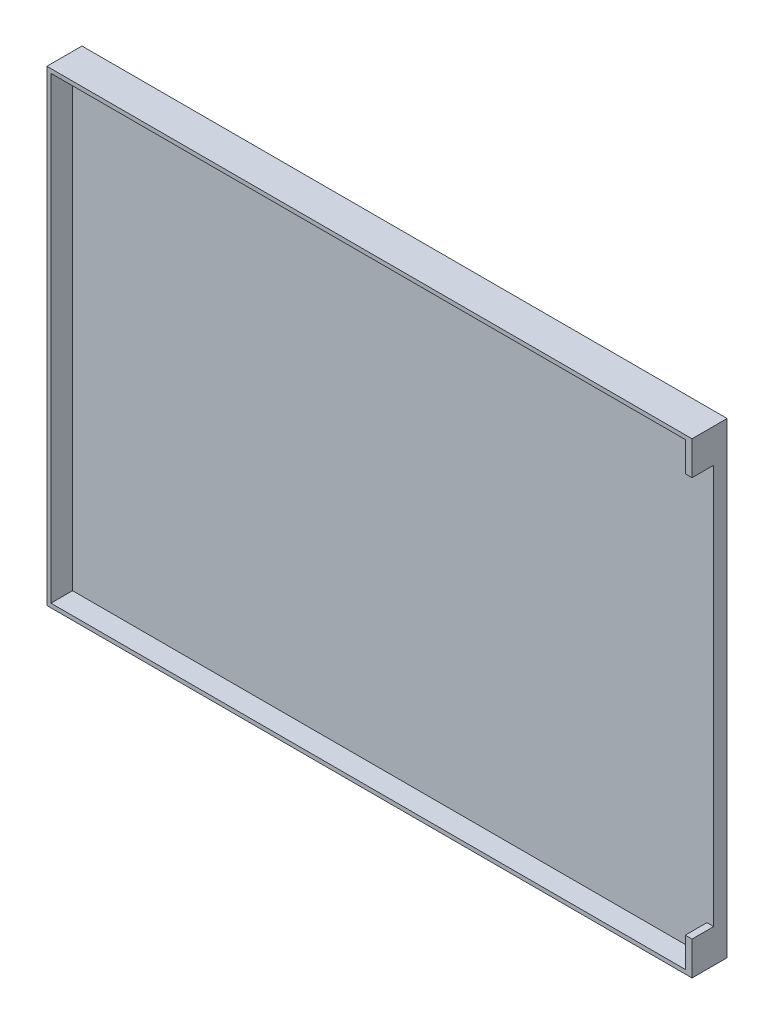
ISO-10303-21;
HEADER;
FILE_DESCRIPTION(('STEP AP214'),'2;1');
FILE_NAME('part.step','',(''),(''),'','','');
FILE_SCHEMA(('AUTOMOTIVE_DESIGN { 1 0 10303 214 1 1 1 1 }'));
ENDSEC;
DATA;
#1=APPLICATION_CONTEXT('core data for automotive mechanical design processes');
#2=APPLICATION_PROTOCOL_DEFINITION('international standard','automotive_design',2000,#1);
#3=PRODUCT_CONTEXT('',#1,'mechanical');
#4=PRODUCT('Part','Part','',(#3));
#5=PRODUCT_RELATED_PRODUCT_CATEGORY('part','',(#4));
#6=PRODUCT_DEFINITION_FORMATION('','',#4);
#7=PRODUCT_DEFINITION_CONTEXT('part definition',#1,'design');
#8=PRODUCT_DEFINITION('design','',#6,#7);
#9=PRODUCT_DEFINITION_SHAPE('','',#8);
#10=(LENGTH_UNIT() NAMED_UNIT(*) SI_UNIT(.MILLI.,.METRE.));
#11=(NAMED_UNIT(*) PLANE_ANGLE_UNIT() SI_UNIT($,.RADIAN.));
#12=(NAMED_UNIT(*) SI_UNIT($,.STERADIAN.) SOLID_ANGLE_UNIT());
#13=UNCERTAINTY_MEASURE_WITH_UNIT(LENGTH_MEASURE(1.E-05),#10,'distance_accuracy_value','');
#14=(GEOMETRIC_REPRESENTATION_CONTEXT(3) GLOBAL_UNCERTAINTY_ASSIGNED_CONTEXT((#13)) GLOBAL_UNIT_ASSIGNED_CONTEXT((#10,
#11,#12)) REPRESENTATION_CONTEXT('',''));
#15=CARTESIAN_POINT('',(0.,0.,0.));
#16=DIRECTION('',(0.,0.,1.));
#17=DIRECTION('',(1.,0.,0.));
#18=AXIS2_PLACEMENT_3D('',#15,#16,#17);
#19=CARTESIAN_POINT('',(0.,0.,1.));
#20=DIRECTION('',(0.,0.,-1.));
#21=DIRECTION('',(-1.,0.,0.));
#22=AXIS2_PLACEMENT_3D('',#19,#20,#21);
#23=PLANE('',#22);
#24=DIRECTION('',(1.,0.,0.));
#25=VECTOR('',#24,1.);
#26=CARTESIAN_POINT('',(23.4,14.8,1.));
#27=LINE('',#26,#25);
#28=CARTESIAN_POINT('',(23.4,14.8,1.));
#29=VERTEX_POINT('',#28);
#30=CARTESIAN_POINT('',(23.9,14.8,1.));
#31=VERTEX_POINT('',#30);
#32=EDGE_CURVE('E48',#29,#31,#27,.T.);
#33=ORIENTED_EDGE('',*,*,#32,.F.);
#34=DIRECTION('',(0.,-1.,0.));
#35=VECTOR('',#34,1.);
#36=CARTESIAN_POINT('',(23.4,17.,1.));
#37=LINE('',#36,#35);
#38=CARTESIAN_POINT('',(23.4,17.,1.));
#39=VERTEX_POINT('',#38);
#40=EDGE_CURVE('E52',#39,#29,#37,.T.);
#41=ORIENTED_EDGE('',*,*,#40,.F.);
#42=DIRECTION('',(1.,0.,0.));
#43=VECTOR('',#42,1.);
#44=CARTESIAN_POINT('',(23.4,17.,1.));
#45=LINE('',#44,#43);
#46=CARTESIAN_POINT('',(-23.6,17.,1.));
#47=VERTEX_POINT('',#46);
#48=EDGE_CURVE('E205',#47,#39,#45,.T.);
#49=ORIENTED_EDGE('',*,*,#48,.F.);
#50=DIRECTION('',(0.,1.,0.));
#51=VECTOR('',#50,1.);
#52=CARTESIAN_POINT('',(-23.6,17.,1.));
#53=LINE('',#52,#51);
#54=CARTESIAN_POINT('',(-23.6,-17.,1.));
#55=VERTEX_POINT('',#54);
#56=EDGE_CURVE('E202',#55,#47,#53,.T.);
#57=ORIENTED_EDGE('',*,*,#56,.F.);
#58=DIRECTION('',(-1.,0.,0.));
#59=VECTOR('',#58,1.);
#60=CARTESIAN_POINT('',(-23.6,-17.,1.));
#61=LINE('',#60,#59);
#62=CARTESIAN_POINT('',(23.4,-17.,1.));
#63=VERTEX_POINT('',#62);
#64=EDGE_CURVE('E199',#63,#55,#61,.T.);
#65=ORIENTED_EDGE('',*,*,#64,.F.);
#66=DIRECTION('',(0.,-1.,0.));
#67=VECTOR('',#66,1.);
#68=CARTESIAN_POINT('',(23.4,-17.,1.));
#69=LINE('',#68,#67);
#70=CARTESIAN_POINT('',(23.4,-14.8,1.));
#71=VERTEX_POINT('',#70);
#72=EDGE_CURVE('E196',#71,#63,#69,.T.);
#73=ORIENTED_EDGE('',*,*,#72,.F.);
#74=DIRECTION('',(-1.,0.,0.));
#75=VECTOR('',#74,1.);
#76=CARTESIAN_POINT('',(23.4,-14.8,1.));
#77=LINE('',#76,#75);
#78=CARTESIAN_POINT('',(23.9,-14.8,1.));
#79=VERTEX_POINT('',#78);
#80=EDGE_CURVE('E194',#79,#71,#77,.T.);
#81=ORIENTED_EDGE('',*,*,#80,.F.);
#82=DIRECTION('',(0.,1.,0.));
#83=VECTOR('',#82,1.);
#84=CARTESIAN_POINT('',(23.9,-17.3,1.));
#85=LINE('',#84,#83);
#86=EDGE_CURVE('E145',#79,#31,#85,.T.);
#87=ORIENTED_EDGE('',*,*,#86,.T.);
#88=EDGE_LOOP('',(#33,#41,#49,#57,#65,#73,#81,#87));
#89=FACE_BOUND('',#88,.T.);
#90=ADVANCED_FACE('F33',(#89),#23,.F.);
#91=CARTESIAN_POINT('',(23.9,-17.3,1.));
#92=DIRECTION('',(-1.,0.,0.));
#93=DIRECTION('',(0.,0.,1.));
#94=AXIS2_PLACEMENT_3D('',#91,#92,#93);
#95=PLANE('',#94);
#96=DIRECTION('',(0.,1.,0.));
#97=VECTOR('',#96,1.);
#98=CARTESIAN_POINT('',(23.9,-17.3,0.));
#99=LINE('',#98,#97);
#100=CARTESIAN_POINT('',(23.9,-17.3,0.));
#101=VERTEX_POINT('',#100);
#102=CARTESIAN_POINT('',(23.9,17.3,0.));
#103=VERTEX_POINT('',#102);
#104=EDGE_CURVE('E146',#101,#103,#99,.T.);
#105=ORIENTED_EDGE('',*,*,#104,.T.);
#106=DIRECTION('',(0.,0.,-1.));
#107=VECTOR('',#106,1.);
#108=CARTESIAN_POINT('',(23.9,17.3,1.));
#109=LINE('',#108,#107);
#110=CARTESIAN_POINT('',(23.9,17.3,2.6));
#111=VERTEX_POINT('',#110);
#112=EDGE_CURVE('E11',#111,#103,#109,.T.);
#113=ORIENTED_EDGE('',*,*,#112,.F.);
#114=DIRECTION('',(0.,1.,0.));
#115=VECTOR('',#114,1.);
#116=CARTESIAN_POINT('',(23.9,14.8,2.6));
#117=LINE('',#116,#115);
#118=CARTESIAN_POINT('',(23.9,14.8,2.6));
#119=VERTEX_POINT('',#118);
#120=EDGE_CURVE('E181',#119,#111,#117,.T.);
#121=ORIENTED_EDGE('',*,*,#120,.F.);
#122=DIRECTION('',(0.,0.,-1.));
#123=VECTOR('',#122,1.);
#124=CARTESIAN_POINT('',(23.9,14.8,2.6));
#125=LINE('',#124,#123);
#126=EDGE_CURVE('E193',#119,#31,#125,.T.);
#127=ORIENTED_EDGE('',*,*,#126,.T.);
#128=ORIENTED_EDGE('',*,*,#86,.F.);
#129=DIRECTION('',(0.,0.,-1.));
#130=VECTOR('',#129,1.);
#131=CARTESIAN_POINT('',(23.9,-14.8,2.6));
#132=LINE('',#131,#130);
#133=CARTESIAN_POINT('',(23.9,-14.8,2.6));
#134=VERTEX_POINT('',#133);
#135=EDGE_CURVE('E125',#134,#79,#132,.T.);
#136=ORIENTED_EDGE('',*,*,#135,.F.);
#137=DIRECTION('',(0.,1.,0.));
#138=VECTOR('',#137,1.);
#139=CARTESIAN_POINT('',(23.9,-14.8,2.6));
#140=LINE('',#139,#138);
#141=CARTESIAN_POINT('',(23.9,-17.3,2.6));
#142=VERTEX_POINT('',#141);
#143=EDGE_CURVE('E131',#142,#134,#140,.T.);
#144=ORIENTED_EDGE('',*,*,#143,.F.);
#145=DIRECTION('',(0.,0.,-1.));
#146=VECTOR('',#145,1.);
#147=CARTESIAN_POINT('',(23.9,-17.3,1.));
#148=LINE('',#147,#146);
#149=EDGE_CURVE('E154',#142,#101,#148,.T.);
#150=ORIENTED_EDGE('',*,*,#149,.T.);
#151=EDGE_LOOP('',(#105,#113,#121,#127,#128,#136,#144,#150));
#152=FACE_BOUND('',#151,.T.);
#153=ADVANCED_FACE('F35',(#152),#95,.F.);
#154=CARTESIAN_POINT('',(-23.9,17.3,1.));
#155=DIRECTION('',(0.,-1.,0.));
#156=DIRECTION('',(0.,0.,-1.));
#157=AXIS2_PLACEMENT_3D('',#154,#155,#156);
#158=PLANE('',#157);
#159=DIRECTION('',(-1.,0.,0.));
#160=VECTOR('',#159,1.);
#161=CARTESIAN_POINT('',(-23.9,17.3,0.));
#162=LINE('',#161,#160);
#163=CARTESIAN_POINT('',(-23.9,17.3,0.));
#164=VERTEX_POINT('',#163);
#165=EDGE_CURVE('E148',#103,#164,#162,.T.);
#166=ORIENTED_EDGE('',*,*,#165,.T.);
#167=DIRECTION('',(0.,0.,-1.));
#168=VECTOR('',#167,1.);
#169=CARTESIAN_POINT('',(-23.9,17.3,1.));
#170=LINE('',#169,#168);
#171=CARTESIAN_POINT('',(-23.9,17.3,2.6));
#172=VERTEX_POINT('',#171);
#173=EDGE_CURVE('E41',#172,#164,#170,.T.);
#174=ORIENTED_EDGE('',*,*,#173,.F.);
#175=DIRECTION('',(-1.,0.,0.));
#176=VECTOR('',#175,1.);
#177=CARTESIAN_POINT('',(23.9,17.3,2.6));
#178=LINE('',#177,#176);
#179=EDGE_CURVE('E182',#111,#172,#178,.T.);
#180=ORIENTED_EDGE('',*,*,#179,.F.);
#181=ORIENTED_EDGE('',*,*,#112,.T.);
#182=EDGE_LOOP('',(#166,#174,#180,#181));
#183=FACE_BOUND('',#182,.T.);
#184=ADVANCED_FACE('F187',(#183),#158,.F.);
#185=CARTESIAN_POINT('',(-23.9,-17.3,1.));
#186=DIRECTION('',(1.,0.,0.));
#187=DIRECTION('',(0.,0.,-1.));
#188=AXIS2_PLACEMENT_3D('',#185,#186,#187);
#189=PLANE('',#188);
#190=DIRECTION('',(0.,-1.,0.));
#191=VECTOR('',#190,1.);
#192=CARTESIAN_POINT('',(-23.9,-17.3,0.));
#193=LINE('',#192,#191);
#194=CARTESIAN_POINT('',(-23.9,-17.3,0.));
#195=VERTEX_POINT('',#194);
#196=EDGE_CURVE('E158',#164,#195,#193,.T.);
#197=ORIENTED_EDGE('',*,*,#196,.T.);
#198=DIRECTION('',(0.,0.,-1.));
#199=VECTOR('',#198,1.);
#200=CARTESIAN_POINT('',(-23.9,-17.3,1.));
#201=LINE('',#200,#199);
#202=CARTESIAN_POINT('',(-23.9,-17.3,2.6));
#203=VERTEX_POINT('',#202);
#204=EDGE_CURVE('E162',#203,#195,#201,.T.);
#205=ORIENTED_EDGE('',*,*,#204,.F.);
#206=DIRECTION('',(0.,-1.,0.));
#207=VECTOR('',#206,1.);
#208=CARTESIAN_POINT('',(-23.9,17.3,2.6));
#209=LINE('',#208,#207);
#210=EDGE_CURVE('E169',#172,#203,#209,.T.);
#211=ORIENTED_EDGE('',*,*,#210,.F.);
#212=ORIENTED_EDGE('',*,*,#173,.T.);
#213=EDGE_LOOP('',(#197,#205,#211,#212));
#214=FACE_BOUND('',#213,.T.);
#215=ADVANCED_FACE('F168',(#214),#189,.F.);
#216=CARTESIAN_POINT('',(-23.9,-17.3,1.));
#217=DIRECTION('',(0.,1.,0.));
#218=DIRECTION('',(0.,0.,1.));
#219=AXIS2_PLACEMENT_3D('',#216,#217,#218);
#220=PLANE('',#219);
#221=DIRECTION('',(1.,0.,0.));
#222=VECTOR('',#221,1.);
#223=CARTESIAN_POINT('',(-23.9,-17.3,0.));
#224=LINE('',#223,#222);
#225=EDGE_CURVE('E155',#195,#101,#224,.T.);
#226=ORIENTED_EDGE('',*,*,#225,.T.);
#227=ORIENTED_EDGE('',*,*,#149,.F.);
#228=DIRECTION('',(1.,0.,0.));
#229=VECTOR('',#228,1.);
#230=CARTESIAN_POINT('',(-23.9,-17.3,2.6));
#231=LINE('',#230,#229);
#232=EDGE_CURVE('E138',#203,#142,#231,.T.);
#233=ORIENTED_EDGE('',*,*,#232,.F.);
#234=ORIENTED_EDGE('',*,*,#204,.T.);
#235=EDGE_LOOP('',(#226,#227,#233,#234));
#236=FACE_BOUND('',#235,.T.);
#237=ADVANCED_FACE('F178',(#236),#220,.F.);
#238=CARTESIAN_POINT('',(0.,0.,0.));
#239=DIRECTION('',(0.,0.,-1.));
#240=DIRECTION('',(-1.,0.,0.));
#241=AXIS2_PLACEMENT_3D('',#238,#239,#240);
#242=PLANE('',#241);
#243=ORIENTED_EDGE('',*,*,#104,.F.);
#244=ORIENTED_EDGE('',*,*,#225,.F.);
#245=ORIENTED_EDGE('',*,*,#196,.F.);
#246=ORIENTED_EDGE('',*,*,#165,.F.);
#247=EDGE_LOOP('',(#243,#244,#245,#246));
#248=FACE_BOUND('',#247,.T.);
#249=ADVANCED_FACE('F176',(#248),#242,.T.);
#250=CARTESIAN_POINT('',(23.4,-14.8,2.6));
#251=DIRECTION('',(0.,-1.,0.));
#252=DIRECTION('',(0.,0.,-1.));
#253=AXIS2_PLACEMENT_3D('',#250,#251,#252);
#254=PLANE('',#253);
#255=ORIENTED_EDGE('',*,*,#80,.T.);
#256=DIRECTION('',(0.,0.,-1.));
#257=VECTOR('',#256,1.);
#258=CARTESIAN_POINT('',(23.4,-14.8,2.6));
#259=LINE('',#258,#257);
#260=CARTESIAN_POINT('',(23.4,-14.8,2.6));
#261=VERTEX_POINT('',#260);
#262=EDGE_CURVE('E127',#261,#71,#259,.T.);
#263=ORIENTED_EDGE('',*,*,#262,.F.);
#264=DIRECTION('',(-1.,0.,0.));
#265=VECTOR('',#264,1.);
#266=CARTESIAN_POINT('',(23.4,-14.8,2.6));
#267=LINE('',#266,#265);
#268=EDGE_CURVE('E120',#134,#261,#267,.T.);
#269=ORIENTED_EDGE('',*,*,#268,.F.);
#270=ORIENTED_EDGE('',*,*,#135,.T.);
#271=EDGE_LOOP('',(#255,#263,#269,#270));
#272=FACE_BOUND('',#271,.T.);
#273=ADVANCED_FACE('F123',(#272),#254,.F.);
#274=CARTESIAN_POINT('',(23.4,-17.,2.6));
#275=DIRECTION('',(1.,0.,0.));
#276=DIRECTION('',(0.,0.,-1.));
#277=AXIS2_PLACEMENT_3D('',#274,#275,#276);
#278=PLANE('',#277);
#279=ORIENTED_EDGE('',*,*,#72,.T.);
#280=DIRECTION('',(0.,0.,-1.));
#281=VECTOR('',#280,1.);
#282=CARTESIAN_POINT('',(23.4,-17.,2.6));
#283=LINE('',#282,#281);
#284=CARTESIAN_POINT('',(23.4,-17.,2.6));
#285=VERTEX_POINT('',#284);
#286=EDGE_CURVE('E150',#285,#63,#283,.T.);
#287=ORIENTED_EDGE('',*,*,#286,.F.);
#288=DIRECTION('',(0.,-1.,0.));
#289=VECTOR('',#288,1.);
#290=CARTESIAN_POINT('',(23.4,-17.,2.6));
#291=LINE('',#290,#289);
#292=EDGE_CURVE('E130',#261,#285,#291,.T.);
#293=ORIENTED_EDGE('',*,*,#292,.F.);
#294=ORIENTED_EDGE('',*,*,#262,.T.);
#295=EDGE_LOOP('',(#279,#287,#293,#294));
#296=FACE_BOUND('',#295,.T.);
#297=ADVANCED_FACE('F229',(#296),#278,.F.);
#298=CARTESIAN_POINT('',(-23.6,-17.,2.6));
#299=DIRECTION('',(0.,-1.,0.));
#300=DIRECTION('',(1.,0.,0.));
#301=AXIS2_PLACEMENT_3D('',#298,#299,#300);
#302=PLANE('',#301);
#303=ORIENTED_EDGE('',*,*,#64,.T.);
#304=DIRECTION('',(0.,0.,-1.));
#305=VECTOR('',#304,1.);
#306=CARTESIAN_POINT('',(-23.6,-17.,2.6));
#307=LINE('',#306,#305);
#308=CARTESIAN_POINT('',(-23.6,-17.,2.6));
#309=VERTEX_POINT('',#308);
#310=EDGE_CURVE('E219',#309,#55,#307,.T.);
#311=ORIENTED_EDGE('',*,*,#310,.F.);
#312=DIRECTION('',(-1.,0.,0.));
#313=VECTOR('',#312,1.);
#314=CARTESIAN_POINT('',(-23.6,-17.,2.6));
#315=LINE('',#314,#313);
#316=EDGE_CURVE('E227',#285,#309,#315,.T.);
#317=ORIENTED_EDGE('',*,*,#316,.F.);
#318=ORIENTED_EDGE('',*,*,#286,.T.);
#319=EDGE_LOOP('',(#303,#311,#317,#318));
#320=FACE_BOUND('',#319,.T.);
#321=ADVANCED_FACE('F225',(#320),#302,.F.);
#322=CARTESIAN_POINT('',(-23.6,17.,2.6));
#323=DIRECTION('',(-1.,0.,0.));
#324=DIRECTION('',(0.,-1.,0.));
#325=AXIS2_PLACEMENT_3D('',#322,#323,#324);
#326=PLANE('',#325);
#327=ORIENTED_EDGE('',*,*,#56,.T.);
#328=DIRECTION('',(0.,0.,-1.));
#329=VECTOR('',#328,1.);
#330=CARTESIAN_POINT('',(-23.6,17.,2.6));
#331=LINE('',#330,#329);
#332=CARTESIAN_POINT('',(-23.6,17.,2.6));
#333=VERTEX_POINT('',#332);
#334=EDGE_CURVE('E216',#333,#47,#331,.T.);
#335=ORIENTED_EDGE('',*,*,#334,.F.);
#336=DIRECTION('',(0.,1.,0.));
#337=VECTOR('',#336,1.);
#338=CARTESIAN_POINT('',(-23.6,17.,2.6));
#339=LINE('',#338,#337);
#340=EDGE_CURVE('E241',#309,#333,#339,.T.);
#341=ORIENTED_EDGE('',*,*,#340,.F.);
#342=ORIENTED_EDGE('',*,*,#310,.T.);
#343=EDGE_LOOP('',(#327,#335,#341,#342));
#344=FACE_BOUND('',#343,.T.);
#345=ADVANCED_FACE('F232',(#344),#326,.F.);
#346=CARTESIAN_POINT('',(23.4,17.,2.6));
#347=DIRECTION('',(0.,1.,0.));
#348=DIRECTION('',(-1.,0.,0.));
#349=AXIS2_PLACEMENT_3D('',#346,#347,#348);
#350=PLANE('',#349);
#351=ORIENTED_EDGE('',*,*,#48,.T.);
#352=DIRECTION('',(0.,0.,-1.));
#353=VECTOR('',#352,1.);
#354=CARTESIAN_POINT('',(23.4,17.,2.6));
#355=LINE('',#354,#353);
#356=CARTESIAN_POINT('',(23.4,17.,2.6));
#357=VERTEX_POINT('',#356);
#358=EDGE_CURVE('E213',#357,#39,#355,.T.);
#359=ORIENTED_EDGE('',*,*,#358,.F.);
#360=DIRECTION('',(1.,0.,0.));
#361=VECTOR('',#360,1.);
#362=CARTESIAN_POINT('',(23.4,17.,2.6));
#363=LINE('',#362,#361);
#364=EDGE_CURVE('E238',#333,#357,#363,.T.);
#365=ORIENTED_EDGE('',*,*,#364,.F.);
#366=ORIENTED_EDGE('',*,*,#334,.T.);
#367=EDGE_LOOP('',(#351,#359,#365,#366));
#368=FACE_BOUND('',#367,.T.);
#369=ADVANCED_FACE('F236',(#368),#350,.F.);
#370=CARTESIAN_POINT('',(23.4,17.,2.6));
#371=DIRECTION('',(1.,0.,0.));
#372=DIRECTION('',(0.,0.,-1.));
#373=AXIS2_PLACEMENT_3D('',#370,#371,#372);
#374=PLANE('',#373);
#375=ORIENTED_EDGE('',*,*,#40,.T.);
#376=DIRECTION('',(0.,0.,-1.));
#377=VECTOR('',#376,1.);
#378=CARTESIAN_POINT('',(23.4,14.8,2.6));
#379=LINE('',#378,#377);
#380=CARTESIAN_POINT('',(23.4,14.8,2.6));
#381=VERTEX_POINT('',#380);
#382=EDGE_CURVE('E210',#381,#29,#379,.T.);
#383=ORIENTED_EDGE('',*,*,#382,.F.);
#384=DIRECTION('',(0.,-1.,0.));
#385=VECTOR('',#384,1.);
#386=CARTESIAN_POINT('',(23.4,17.,2.6));
#387=LINE('',#386,#385);
#388=EDGE_CURVE('E240',#357,#381,#387,.T.);
#389=ORIENTED_EDGE('',*,*,#388,.F.);
#390=ORIENTED_EDGE('',*,*,#358,.T.);
#391=EDGE_LOOP('',(#375,#383,#389,#390));
#392=FACE_BOUND('',#391,.T.);
#393=ADVANCED_FACE('F249',(#392),#374,.F.);
#394=CARTESIAN_POINT('',(23.4,14.8,2.6));
#395=DIRECTION('',(0.,1.,0.));
#396=DIRECTION('',(0.,0.,1.));
#397=AXIS2_PLACEMENT_3D('',#394,#395,#396);
#398=PLANE('',#397);
#399=ORIENTED_EDGE('',*,*,#32,.T.);
#400=ORIENTED_EDGE('',*,*,#126,.F.);
#401=DIRECTION('',(1.,0.,0.));
#402=VECTOR('',#401,1.);
#403=CARTESIAN_POINT('',(23.4,14.8,2.6));
#404=LINE('',#403,#402);
#405=EDGE_CURVE('E184',#381,#119,#404,.T.);
#406=ORIENTED_EDGE('',*,*,#405,.F.);
#407=ORIENTED_EDGE('',*,*,#382,.T.);
#408=EDGE_LOOP('',(#399,#400,#406,#407));
#409=FACE_BOUND('',#408,.T.);
#410=ADVANCED_FACE('F251',(#409),#398,.F.);
#411=CARTESIAN_POINT('',(0.,0.,2.6));
#412=DIRECTION('',(0.,0.,1.));
#413=DIRECTION('',(1.,0.,0.));
#414=AXIS2_PLACEMENT_3D('',#411,#412,#413);
#415=PLANE('',#414);
#416=ORIENTED_EDGE('',*,*,#143,.T.);
#417=ORIENTED_EDGE('',*,*,#268,.T.);
#418=ORIENTED_EDGE('',*,*,#292,.T.);
#419=ORIENTED_EDGE('',*,*,#316,.T.);
#420=ORIENTED_EDGE('',*,*,#340,.T.);
#421=ORIENTED_EDGE('',*,*,#364,.T.);
#422=ORIENTED_EDGE('',*,*,#388,.T.);
#423=ORIENTED_EDGE('',*,*,#405,.T.);
#424=ORIENTED_EDGE('',*,*,#120,.T.);
#425=ORIENTED_EDGE('',*,*,#179,.T.);
#426=ORIENTED_EDGE('',*,*,#210,.T.);
#427=ORIENTED_EDGE('',*,*,#232,.T.);
#428=EDGE_LOOP('',(#416,#417,#418,#419,#420,#421,#422,#423,#424,#425,#426,#427));
#429=FACE_BOUND('',#428,.T.);
#430=ADVANCED_FACE('F135',(#429),#415,.T.);
#431=CLOSED_SHELL('',(#90,#153,#184,#215,#237,#249,#273,#297,#321,#345,#369,#393,#410,#430));
#432=MANIFOLD_SOLID_BREP('B2',#431);
#433=ADVANCED_BREP_SHAPE_REPRESENTATION('',(#18,#432),#14);
#434=SHAPE_DEFINITION_REPRESENTATION(#9,#433);
ENDSEC;
END-ISO-10303-21;
